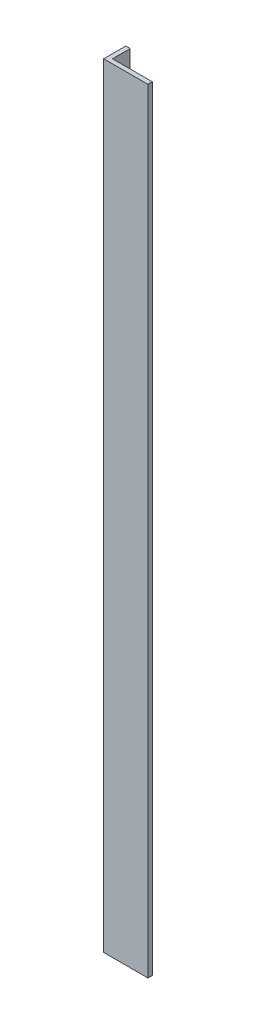
ISO-10303-21;
HEADER;
FILE_DESCRIPTION(('STEP AP214'),'2;1');
FILE_NAME('part.step','',(''),(''),'','','');
FILE_SCHEMA(('AUTOMOTIVE_DESIGN { 1 0 10303 214 1 1 1 1 }'));
ENDSEC;
DATA;
#1=APPLICATION_CONTEXT('core data for automotive mechanical design processes');
#2=APPLICATION_PROTOCOL_DEFINITION('international standard','automotive_design',2000,#1);
#3=PRODUCT_CONTEXT('',#1,'mechanical');
#4=PRODUCT('Part','Part','',(#3));
#5=PRODUCT_RELATED_PRODUCT_CATEGORY('part','',(#4));
#6=PRODUCT_DEFINITION_FORMATION('','',#4);
#7=PRODUCT_DEFINITION_CONTEXT('part definition',#1,'design');
#8=PRODUCT_DEFINITION('design','',#6,#7);
#9=PRODUCT_DEFINITION_SHAPE('','',#8);
#10=(LENGTH_UNIT() NAMED_UNIT(*) SI_UNIT(.MILLI.,.METRE.));
#11=(NAMED_UNIT(*) PLANE_ANGLE_UNIT() SI_UNIT($,.RADIAN.));
#12=(NAMED_UNIT(*) SI_UNIT($,.STERADIAN.) SOLID_ANGLE_UNIT());
#13=UNCERTAINTY_MEASURE_WITH_UNIT(LENGTH_MEASURE(1.E-05),#10,'distance_accuracy_value','');
#14=(GEOMETRIC_REPRESENTATION_CONTEXT(3) GLOBAL_UNCERTAINTY_ASSIGNED_CONTEXT((#13)) GLOBAL_UNIT_ASSIGNED_CONTEXT((#10,
#11,#12)) REPRESENTATION_CONTEXT('',''));
#15=CARTESIAN_POINT('',(0.,0.,0.));
#16=DIRECTION('',(0.,0.,1.));
#17=DIRECTION('',(1.,0.,0.));
#18=AXIS2_PLACEMENT_3D('',#15,#16,#17);
#19=CARTESIAN_POINT('',(20.,350.,0.));
#20=DIRECTION('',(0.,0.,-1.));
#21=DIRECTION('',(-1.,0.,0.));
#22=AXIS2_PLACEMENT_3D('',#19,#20,#21);
#23=PLANE('',#22);
#24=DIRECTION('',(1.,0.,0.));
#25=VECTOR('',#24,1.);
#26=CARTESIAN_POINT('',(20.,0.,0.));
#27=LINE('',#26,#25);
#28=CARTESIAN_POINT('',(0.,0.,0.));
#29=VERTEX_POINT('',#28);
#30=CARTESIAN_POINT('',(20.,0.,0.));
#31=VERTEX_POINT('',#30);
#32=EDGE_CURVE('E116',#29,#31,#27,.T.);
#33=ORIENTED_EDGE('',*,*,#32,.T.);
#34=DIRECTION('',(0.,-1.,0.));
#35=VECTOR('',#34,1.);
#36=CARTESIAN_POINT('',(20.,350.,0.));
#37=LINE('',#36,#35);
#38=CARTESIAN_POINT('',(20.,350.,0.));
#39=VERTEX_POINT('',#38);
#40=EDGE_CURVE('E11',#39,#31,#37,.T.);
#41=ORIENTED_EDGE('',*,*,#40,.F.);
#42=DIRECTION('',(1.,0.,0.));
#43=VECTOR('',#42,1.);
#44=CARTESIAN_POINT('',(20.,350.,0.));
#45=LINE('',#44,#43);
#46=CARTESIAN_POINT('',(0.,350.,0.));
#47=VERTEX_POINT('',#46);
#48=EDGE_CURVE('E126',#47,#39,#45,.T.);
#49=ORIENTED_EDGE('',*,*,#48,.F.);
#50=DIRECTION('',(0.,-1.,0.));
#51=VECTOR('',#50,1.);
#52=CARTESIAN_POINT('',(0.,350.,0.));
#53=LINE('',#52,#51);
#54=EDGE_CURVE('E112',#47,#29,#53,.T.);
#55=ORIENTED_EDGE('',*,*,#54,.T.);
#56=EDGE_LOOP('',(#33,#41,#49,#55));
#57=FACE_BOUND('',#56,.T.);
#58=ADVANCED_FACE('F32',(#57),#23,.F.);
#59=CARTESIAN_POINT('',(20.,350.,-2.));
#60=DIRECTION('',(-1.,0.,0.));
#61=DIRECTION('',(0.,0.,1.));
#62=AXIS2_PLACEMENT_3D('',#59,#60,#61);
#63=PLANE('',#62);
#64=DIRECTION('',(0.,0.,-1.));
#65=VECTOR('',#64,1.);
#66=CARTESIAN_POINT('',(20.,0.,-2.));
#67=LINE('',#66,#65);
#68=CARTESIAN_POINT('',(20.,0.,-2.));
#69=VERTEX_POINT('',#68);
#70=EDGE_CURVE('E119',#31,#69,#67,.T.);
#71=ORIENTED_EDGE('',*,*,#70,.T.);
#72=DIRECTION('',(0.,-1.,0.));
#73=VECTOR('',#72,1.);
#74=CARTESIAN_POINT('',(20.,350.,-2.));
#75=LINE('',#74,#73);
#76=CARTESIAN_POINT('',(20.,350.,-2.));
#77=VERTEX_POINT('',#76);
#78=EDGE_CURVE('E40',#77,#69,#75,.T.);
#79=ORIENTED_EDGE('',*,*,#78,.F.);
#80=DIRECTION('',(0.,0.,-1.));
#81=VECTOR('',#80,1.);
#82=CARTESIAN_POINT('',(20.,350.,-2.));
#83=LINE('',#82,#81);
#84=EDGE_CURVE('E85',#39,#77,#83,.T.);
#85=ORIENTED_EDGE('',*,*,#84,.F.);
#86=ORIENTED_EDGE('',*,*,#40,.T.);
#87=EDGE_LOOP('',(#71,#79,#85,#86));
#88=FACE_BOUND('',#87,.T.);
#89=ADVANCED_FACE('F150',(#88),#63,.F.);
#90=CARTESIAN_POINT('',(2.,350.,-2.));
#91=DIRECTION('',(0.,0.,1.));
#92=DIRECTION('',(1.,0.,0.));
#93=AXIS2_PLACEMENT_3D('',#90,#91,#92);
#94=PLANE('',#93);
#95=DIRECTION('',(-1.,0.,0.));
#96=VECTOR('',#95,1.);
#97=CARTESIAN_POINT('',(2.,0.,-2.));
#98=LINE('',#97,#96);
#99=CARTESIAN_POINT('',(2.,0.,-2.));
#100=VERTEX_POINT('',#99);
#101=EDGE_CURVE('E121',#69,#100,#98,.T.);
#102=ORIENTED_EDGE('',*,*,#101,.T.);
#103=DIRECTION('',(0.,-1.,0.));
#104=VECTOR('',#103,1.);
#105=CARTESIAN_POINT('',(2.,350.,-2.));
#106=LINE('',#105,#104);
#107=CARTESIAN_POINT('',(2.,350.,-2.));
#108=VERTEX_POINT('',#107);
#109=EDGE_CURVE('E107',#108,#100,#106,.T.);
#110=ORIENTED_EDGE('',*,*,#109,.F.);
#111=DIRECTION('',(-1.,0.,0.));
#112=VECTOR('',#111,1.);
#113=CARTESIAN_POINT('',(2.,350.,-2.));
#114=LINE('',#113,#112);
#115=EDGE_CURVE('E98',#77,#108,#114,.T.);
#116=ORIENTED_EDGE('',*,*,#115,.F.);
#117=ORIENTED_EDGE('',*,*,#78,.T.);
#118=EDGE_LOOP('',(#102,#110,#116,#117));
#119=FACE_BOUND('',#118,.T.);
#120=ADVANCED_FACE('F132',(#119),#94,.F.);
#121=CARTESIAN_POINT('',(2.,350.,-10.));
#122=DIRECTION('',(-1.,0.,0.));
#123=DIRECTION('',(0.,0.,1.));
#124=AXIS2_PLACEMENT_3D('',#121,#122,#123);
#125=PLANE('',#124);
#126=DIRECTION('',(0.,0.,-1.));
#127=VECTOR('',#126,1.);
#128=CARTESIAN_POINT('',(2.,0.,-10.));
#129=LINE('',#128,#127);
#130=CARTESIAN_POINT('',(2.,0.,-10.));
#131=VERTEX_POINT('',#130);
#132=EDGE_CURVE('E106',#100,#131,#129,.T.);
#133=ORIENTED_EDGE('',*,*,#132,.T.);
#134=DIRECTION('',(0.,-1.,0.));
#135=VECTOR('',#134,1.);
#136=CARTESIAN_POINT('',(2.,350.,-10.));
#137=LINE('',#136,#135);
#138=CARTESIAN_POINT('',(2.,350.,-10.));
#139=VERTEX_POINT('',#138);
#140=EDGE_CURVE('E103',#139,#131,#137,.T.);
#141=ORIENTED_EDGE('',*,*,#140,.F.);
#142=DIRECTION('',(0.,0.,-1.));
#143=VECTOR('',#142,1.);
#144=CARTESIAN_POINT('',(2.,350.,-10.));
#145=LINE('',#144,#143);
#146=EDGE_CURVE('E92',#108,#139,#145,.T.);
#147=ORIENTED_EDGE('',*,*,#146,.F.);
#148=ORIENTED_EDGE('',*,*,#109,.T.);
#149=EDGE_LOOP('',(#133,#141,#147,#148));
#150=FACE_BOUND('',#149,.T.);
#151=ADVANCED_FACE('F104',(#150),#125,.F.);
#152=CARTESIAN_POINT('',(0.,350.,-10.));
#153=DIRECTION('',(0.,0.,1.));
#154=DIRECTION('',(1.,0.,0.));
#155=AXIS2_PLACEMENT_3D('',#152,#153,#154);
#156=PLANE('',#155);
#157=DIRECTION('',(-1.,0.,0.));
#158=VECTOR('',#157,1.);
#159=CARTESIAN_POINT('',(0.,0.,-10.));
#160=LINE('',#159,#158);
#161=CARTESIAN_POINT('',(0.,0.,-10.));
#162=VERTEX_POINT('',#161);
#163=EDGE_CURVE('E71',#131,#162,#160,.T.);
#164=ORIENTED_EDGE('',*,*,#163,.T.);
#165=DIRECTION('',(0.,-1.,0.));
#166=VECTOR('',#165,1.);
#167=CARTESIAN_POINT('',(0.,350.,-10.));
#168=LINE('',#167,#166);
#169=CARTESIAN_POINT('',(0.,350.,-10.));
#170=VERTEX_POINT('',#169);
#171=EDGE_CURVE('E108',#170,#162,#168,.T.);
#172=ORIENTED_EDGE('',*,*,#171,.F.);
#173=DIRECTION('',(-1.,0.,0.));
#174=VECTOR('',#173,1.);
#175=CARTESIAN_POINT('',(0.,350.,-10.));
#176=LINE('',#175,#174);
#177=EDGE_CURVE('E96',#139,#170,#176,.T.);
#178=ORIENTED_EDGE('',*,*,#177,.F.);
#179=ORIENTED_EDGE('',*,*,#140,.T.);
#180=EDGE_LOOP('',(#164,#172,#178,#179));
#181=FACE_BOUND('',#180,.T.);
#182=ADVANCED_FACE('F110',(#181),#156,.F.);
#183=CARTESIAN_POINT('',(0.,350.,0.));
#184=DIRECTION('',(1.,0.,0.));
#185=DIRECTION('',(0.,0.,-1.));
#186=AXIS2_PLACEMENT_3D('',#183,#184,#185);
#187=PLANE('',#186);
#188=DIRECTION('',(0.,0.,1.));
#189=VECTOR('',#188,1.);
#190=CARTESIAN_POINT('',(0.,0.,0.));
#191=LINE('',#190,#189);
#192=EDGE_CURVE('E77',#162,#29,#191,.T.);
#193=ORIENTED_EDGE('',*,*,#192,.T.);
#194=ORIENTED_EDGE('',*,*,#54,.F.);
#195=DIRECTION('',(0.,0.,1.));
#196=VECTOR('',#195,1.);
#197=CARTESIAN_POINT('',(0.,350.,0.));
#198=LINE('',#197,#196);
#199=EDGE_CURVE('E48',#170,#47,#198,.T.);
#200=ORIENTED_EDGE('',*,*,#199,.F.);
#201=ORIENTED_EDGE('',*,*,#171,.T.);
#202=EDGE_LOOP('',(#193,#194,#200,#201));
#203=FACE_BOUND('',#202,.T.);
#204=ADVANCED_FACE('F139',(#203),#187,.F.);
#205=CARTESIAN_POINT('',(0.,350.,0.));
#206=DIRECTION('',(0.,-1.,0.));
#207=DIRECTION('',(0.,0.,-1.));
#208=AXIS2_PLACEMENT_3D('',#205,#206,#207);
#209=PLANE('',#208);
#210=ORIENTED_EDGE('',*,*,#48,.T.);
#211=ORIENTED_EDGE('',*,*,#84,.T.);
#212=ORIENTED_EDGE('',*,*,#115,.T.);
#213=ORIENTED_EDGE('',*,*,#146,.T.);
#214=ORIENTED_EDGE('',*,*,#177,.T.);
#215=ORIENTED_EDGE('',*,*,#199,.T.);
#216=EDGE_LOOP('',(#210,#211,#212,#213,#214,#215));
#217=FACE_BOUND('',#216,.T.);
#218=ADVANCED_FACE('F94',(#217),#209,.F.);
#219=CARTESIAN_POINT('',(0.,0.,0.));
#220=DIRECTION('',(0.,-1.,0.));
#221=DIRECTION('',(0.,0.,-1.));
#222=AXIS2_PLACEMENT_3D('',#219,#220,#221);
#223=PLANE('',#222);
#224=ORIENTED_EDGE('',*,*,#32,.F.);
#225=ORIENTED_EDGE('',*,*,#192,.F.);
#226=ORIENTED_EDGE('',*,*,#163,.F.);
#227=ORIENTED_EDGE('',*,*,#132,.F.);
#228=ORIENTED_EDGE('',*,*,#101,.F.);
#229=ORIENTED_EDGE('',*,*,#70,.F.);
#230=EDGE_LOOP('',(#224,#225,#226,#227,#228,#229));
#231=FACE_BOUND('',#230,.T.);
#232=ADVANCED_FACE('F135',(#231),#223,.T.);
#233=CLOSED_SHELL('',(#58,#89,#120,#151,#182,#204,#218,#232));
#234=MANIFOLD_SOLID_BREP('B2',#233);
#235=ADVANCED_BREP_SHAPE_REPRESENTATION('',(#18,#234),#14);
#236=SHAPE_DEFINITION_REPRESENTATION(#9,#235);
ENDSEC;
END-ISO-10303-21;
